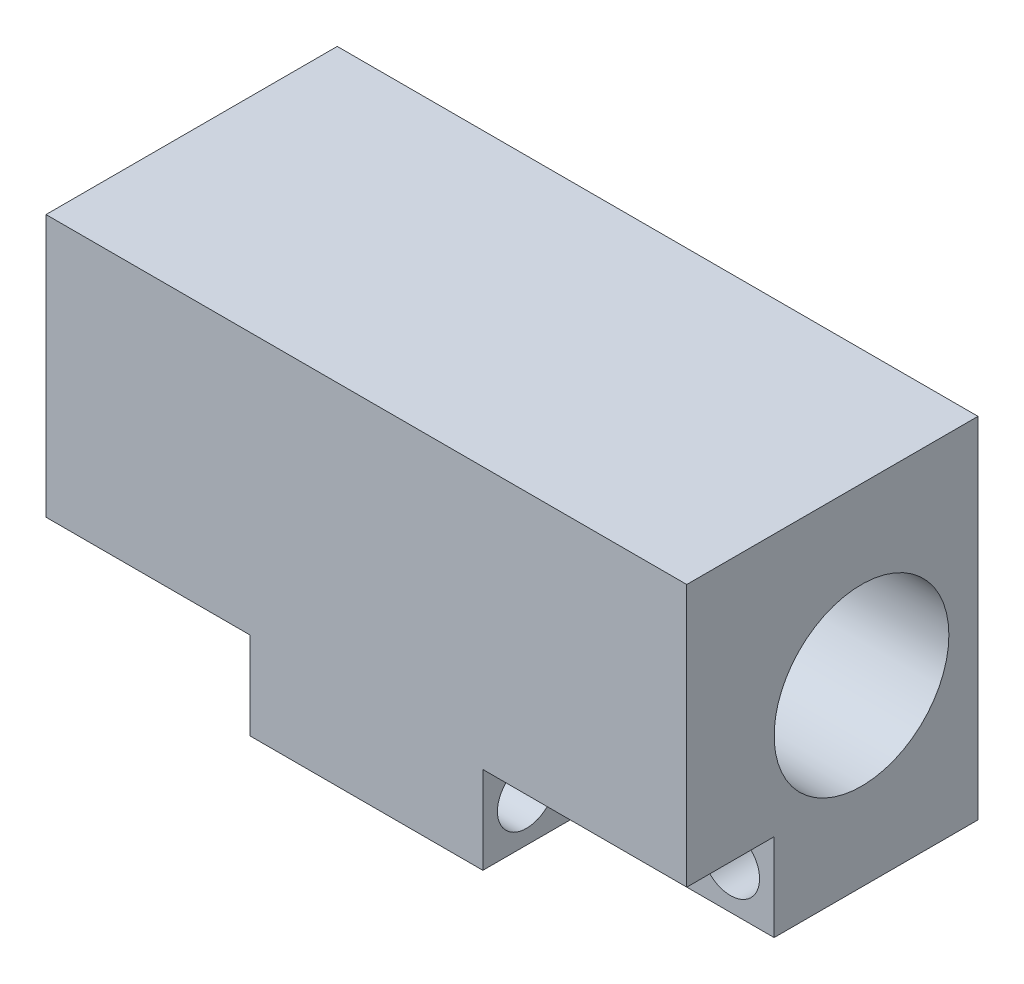
ISO-10303-21;
HEADER;
FILE_DESCRIPTION(('STEP AP214'),'2;1');
FILE_NAME('part.step','',(''),(''),'','','');
FILE_SCHEMA(('AUTOMOTIVE_DESIGN { 1 0 10303 214 1 1 1 1 }'));
ENDSEC;
DATA;
#1=APPLICATION_CONTEXT('core data for automotive mechanical design processes');
#2=APPLICATION_PROTOCOL_DEFINITION('international standard','automotive_design',2000,#1);
#3=PRODUCT_CONTEXT('',#1,'mechanical');
#4=PRODUCT('Part','Part','',(#3));
#5=PRODUCT_RELATED_PRODUCT_CATEGORY('part','',(#4));
#6=PRODUCT_DEFINITION_FORMATION('','',#4);
#7=PRODUCT_DEFINITION_CONTEXT('part definition',#1,'design');
#8=PRODUCT_DEFINITION('design','',#6,#7);
#9=PRODUCT_DEFINITION_SHAPE('','',#8);
#10=(LENGTH_UNIT() NAMED_UNIT(*) SI_UNIT(.MILLI.,.METRE.));
#11=(NAMED_UNIT(*) PLANE_ANGLE_UNIT() SI_UNIT($,.RADIAN.));
#12=(NAMED_UNIT(*) SI_UNIT($,.STERADIAN.) SOLID_ANGLE_UNIT());
#13=UNCERTAINTY_MEASURE_WITH_UNIT(LENGTH_MEASURE(1.E-05),#10,'distance_accuracy_value','');
#14=(GEOMETRIC_REPRESENTATION_CONTEXT(3) GLOBAL_UNCERTAINTY_ASSIGNED_CONTEXT((#13)) GLOBAL_UNIT_ASSIGNED_CONTEXT((#10,
#11,#12)) REPRESENTATION_CONTEXT('',''));
#15=CARTESIAN_POINT('',(0.,0.,0.));
#16=DIRECTION('',(0.,0.,1.));
#17=DIRECTION('',(1.,0.,0.));
#18=AXIS2_PLACEMENT_3D('',#15,#16,#17);
#19=CARTESIAN_POINT('',(11.,6.,-6.));
#20=DIRECTION('',(-1.,0.,0.));
#21=DIRECTION('',(0.,0.,1.));
#22=AXIS2_PLACEMENT_3D('',#19,#20,#21);
#23=CYLINDRICAL_SURFACE('',#22,1.5);
#24=CARTESIAN_POINT('',(-3.,6.,-6.));
#25=DIRECTION('',(1.,0.,0.));
#26=DIRECTION('',(0.,0.,-1.));
#27=AXIS2_PLACEMENT_3D('',#24,#25,#26);
#28=CIRCLE('',#27,1.5);
#29=CARTESIAN_POINT('',(-3.,6.,-7.5));
#30=VERTEX_POINT('',#29);
#31=EDGE_CURVE('E291',#30,#30,#28,.T.);
#32=ORIENTED_EDGE('',*,*,#31,.T.);
#33=EDGE_LOOP('',(#32));
#34=FACE_BOUND('',#33,.T.);
#35=CARTESIAN_POINT('',(-4.5,6.,-6.));
#36=DIRECTION('',(-1.,0.,0.));
#37=DIRECTION('',(0.,0.,1.));
#38=AXIS2_PLACEMENT_3D('',#35,#36,#37);
#39=CIRCLE('',#38,1.5);
#40=CARTESIAN_POINT('',(-4.5,6.,-4.5));
#41=VERTEX_POINT('',#40);
#42=EDGE_CURVE('E37',#41,#41,#39,.F.);
#43=ORIENTED_EDGE('',*,*,#42,.F.);
#44=EDGE_LOOP('',(#43));
#45=FACE_BOUND('',#44,.T.);
#46=ADVANCED_FACE('F33',(#34,#45),#23,.F.);
#47=CARTESIAN_POINT('',(3.,6.,-6.));
#48=DIRECTION('',(1.,0.,0.));
#49=DIRECTION('',(0.,0.,-1.));
#50=AXIS2_PLACEMENT_3D('',#47,#48,#49);
#51=CIRCLE('',#50,1.5);
#52=CARTESIAN_POINT('',(3.,6.,-7.5));
#53=VERTEX_POINT('',#52);
#54=EDGE_CURVE('E287',#53,#53,#51,.T.);
#55=ORIENTED_EDGE('',*,*,#54,.F.);
#56=EDGE_LOOP('',(#55));
#57=FACE_BOUND('',#56,.T.);
#58=CARTESIAN_POINT('',(4.5,6.,-6.));
#59=DIRECTION('',(1.,0.,0.));
#60=DIRECTION('',(0.,0.,-1.));
#61=AXIS2_PLACEMENT_3D('',#58,#59,#60);
#62=CIRCLE('',#61,1.5);
#63=CARTESIAN_POINT('',(4.5,6.,-7.5));
#64=VERTEX_POINT('',#63);
#65=EDGE_CURVE('E231',#64,#64,#62,.F.);
#66=ORIENTED_EDGE('',*,*,#65,.F.);
#67=EDGE_LOOP('',(#66));
#68=FACE_BOUND('',#67,.T.);
#69=ADVANCED_FACE('F364',(#57,#68),#23,.F.);
#70=CARTESIAN_POINT('',(11.,1.5,-1.5));
#71=DIRECTION('',(-1.,0.,0.));
#72=DIRECTION('',(0.,0.,1.));
#73=AXIS2_PLACEMENT_3D('',#70,#71,#72);
#74=CYLINDRICAL_SURFACE('',#73,1.);
#75=CARTESIAN_POINT('',(4.,1.5,-1.5));
#76=DIRECTION('',(-1.,0.,0.));
#77=DIRECTION('',(0.,0.,1.));
#78=AXIS2_PLACEMENT_3D('',#75,#76,#77);
#79=CIRCLE('',#78,1.);
#80=CARTESIAN_POINT('',(4.,1.5,-0.499999999999997));
#81=VERTEX_POINT('',#80);
#82=EDGE_CURVE('E256',#81,#81,#79,.F.);
#83=ORIENTED_EDGE('',*,*,#82,.T.);
#84=EDGE_LOOP('',(#83));
#85=FACE_BOUND('',#84,.T.);
#86=CARTESIAN_POINT('',(-4.,1.5,-1.5));
#87=DIRECTION('',(-1.,0.,0.));
#88=DIRECTION('',(0.,0.,1.));
#89=AXIS2_PLACEMENT_3D('',#86,#87,#88);
#90=CIRCLE('',#89,1.);
#91=CARTESIAN_POINT('',(-4.,1.5,-0.499999999999997));
#92=VERTEX_POINT('',#91);
#93=EDGE_CURVE('E262',#92,#92,#90,.T.);
#94=ORIENTED_EDGE('',*,*,#93,.T.);
#95=EDGE_LOOP('',(#94));
#96=FACE_BOUND('',#95,.T.);
#97=ADVANCED_FACE('F366',(#85,#96),#74,.F.);
#98=CARTESIAN_POINT('',(-11.,12.,0.));
#99=DIRECTION('',(-1.,0.,0.));
#100=DIRECTION('',(0.,0.,1.));
#101=AXIS2_PLACEMENT_3D('',#98,#99,#100);
#102=PLANE('',#101);
#103=DIRECTION('',(0.,-0.5,-0.866025403784439));
#104=VECTOR('',#103,1.);
#105=CARTESIAN_POINT('',(-11.,9.46410161513775,-6.));
#106=LINE('',#105,#104);
#107=CARTESIAN_POINT('',(-11.,9.46410161513775,-6.));
#108=VERTEX_POINT('',#107);
#109=CARTESIAN_POINT('',(-11.,7.73205080756887,-8.99999999999999));
#110=VERTEX_POINT('',#109);
#111=EDGE_CURVE('E50',#108,#110,#106,.T.);
#112=ORIENTED_EDGE('',*,*,#111,.F.);
#113=DIRECTION('',(0.,0.5,-0.866025403784439));
#114=VECTOR('',#113,1.);
#115=CARTESIAN_POINT('',(-11.,7.73205080756887,-2.99999999999999));
#116=LINE('',#115,#114);
#117=CARTESIAN_POINT('',(-11.,7.73205080756887,-2.99999999999999));
#118=VERTEX_POINT('',#117);
#119=EDGE_CURVE('E195',#118,#108,#116,.T.);
#120=ORIENTED_EDGE('',*,*,#119,.F.);
#121=DIRECTION('',(0.,1.,0.));
#122=VECTOR('',#121,1.);
#123=CARTESIAN_POINT('',(-11.,4.26794919243112,-2.99999999999999));
#124=LINE('',#123,#122);
#125=CARTESIAN_POINT('',(-11.,4.26794919243112,-2.99999999999999));
#126=VERTEX_POINT('',#125);
#127=EDGE_CURVE('E198',#126,#118,#124,.T.);
#128=ORIENTED_EDGE('',*,*,#127,.F.);
#129=DIRECTION('',(0.,0.5,0.866025403784439));
#130=VECTOR('',#129,1.);
#131=CARTESIAN_POINT('',(-11.,2.53589838486224,-5.99999999999999));
#132=LINE('',#131,#130);
#133=CARTESIAN_POINT('',(-11.,2.53589838486224,-5.99999999999999));
#134=VERTEX_POINT('',#133);
#135=EDGE_CURVE('E214',#134,#126,#132,.T.);
#136=ORIENTED_EDGE('',*,*,#135,.F.);
#137=DIRECTION('',(0.,-0.5,0.866025403784439));
#138=VECTOR('',#137,1.);
#139=CARTESIAN_POINT('',(-11.,4.26794919243112,-8.99999999999999));
#140=LINE('',#139,#138);
#141=CARTESIAN_POINT('',(-11.,4.26794919243112,-8.99999999999999));
#142=VERTEX_POINT('',#141);
#143=EDGE_CURVE('E211',#142,#134,#140,.T.);
#144=ORIENTED_EDGE('',*,*,#143,.F.);
#145=DIRECTION('',(0.,-1.,0.));
#146=VECTOR('',#145,1.);
#147=CARTESIAN_POINT('',(-11.,7.73205080756887,-8.99999999999999));
#148=LINE('',#147,#146);
#149=EDGE_CURVE('E209',#110,#142,#148,.T.);
#150=ORIENTED_EDGE('',*,*,#149,.F.);
#151=EDGE_LOOP('',(#112,#120,#128,#136,#144,#150));
#152=FACE_BOUND('',#151,.T.);
#153=DIRECTION('',(0.,0.,-1.));
#154=VECTOR('',#153,1.);
#155=CARTESIAN_POINT('',(-11.,0.,0.));
#156=LINE('',#155,#154);
#157=CARTESIAN_POINT('',(-11.,0.,-3.));
#158=VERTEX_POINT('',#157);
#159=CARTESIAN_POINT('',(-11.,0.,-10.));
#160=VERTEX_POINT('',#159);
#161=EDGE_CURVE('E328',#158,#160,#156,.T.);
#162=ORIENTED_EDGE('',*,*,#161,.F.);
#163=DIRECTION('',(0.,-1.,0.));
#164=VECTOR('',#163,1.);
#165=CARTESIAN_POINT('',(-11.,3.,-3.));
#166=LINE('',#165,#164);
#167=CARTESIAN_POINT('',(-11.,3.,-3.));
#168=VERTEX_POINT('',#167);
#169=EDGE_CURVE('E274',#168,#158,#166,.T.);
#170=ORIENTED_EDGE('',*,*,#169,.F.);
#171=DIRECTION('',(0.,0.,1.));
#172=VECTOR('',#171,1.);
#173=CARTESIAN_POINT('',(-11.,3.,0.));
#174=LINE('',#173,#172);
#175=CARTESIAN_POINT('',(-11.,3.,0.));
#176=VERTEX_POINT('',#175);
#177=EDGE_CURVE('E263',#168,#176,#174,.T.);
#178=ORIENTED_EDGE('',*,*,#177,.T.);
#179=DIRECTION('',(0.,-1.,0.));
#180=VECTOR('',#179,1.);
#181=CARTESIAN_POINT('',(-11.,12.,0.));
#182=LINE('',#181,#180);
#183=CARTESIAN_POINT('',(-11.,12.,0.));
#184=VERTEX_POINT('',#183);
#185=EDGE_CURVE('E42',#184,#176,#182,.T.);
#186=ORIENTED_EDGE('',*,*,#185,.F.);
#187=DIRECTION('',(0.,0.,-1.));
#188=VECTOR('',#187,1.);
#189=CARTESIAN_POINT('',(-11.,12.,0.));
#190=LINE('',#189,#188);
#191=CARTESIAN_POINT('',(-11.,12.,-10.));
#192=VERTEX_POINT('',#191);
#193=EDGE_CURVE('E334',#184,#192,#190,.T.);
#194=ORIENTED_EDGE('',*,*,#193,.T.);
#195=DIRECTION('',(0.,-1.,0.));
#196=VECTOR('',#195,1.);
#197=CARTESIAN_POINT('',(-11.,12.,-10.));
#198=LINE('',#197,#196);
#199=EDGE_CURVE('E11',#192,#160,#198,.T.);
#200=ORIENTED_EDGE('',*,*,#199,.T.);
#201=EDGE_LOOP('',(#162,#170,#178,#186,#194,#200));
#202=FACE_BOUND('',#201,.T.);
#203=ADVANCED_FACE('F373',(#152,#202),#102,.T.);
#204=CARTESIAN_POINT('',(11.,12.,0.));
#205=DIRECTION('',(0.,0.,1.));
#206=DIRECTION('',(1.,0.,0.));
#207=AXIS2_PLACEMENT_3D('',#204,#205,#206);
#208=PLANE('',#207);
#209=DIRECTION('',(0.,-1.,0.));
#210=VECTOR('',#209,1.);
#211=CARTESIAN_POINT('',(4.,3.,0.));
#212=LINE('',#211,#210);
#213=CARTESIAN_POINT('',(4.,3.,0.));
#214=VERTEX_POINT('',#213);
#215=CARTESIAN_POINT('',(4.,0.,0.));
#216=VERTEX_POINT('',#215);
#217=EDGE_CURVE('E244',#214,#216,#212,.T.);
#218=ORIENTED_EDGE('',*,*,#217,.F.);
#219=DIRECTION('',(-1.,0.,0.));
#220=VECTOR('',#219,1.);
#221=CARTESIAN_POINT('',(11.,3.,0.));
#222=LINE('',#221,#220);
#223=CARTESIAN_POINT('',(11.,3.,0.));
#224=VERTEX_POINT('',#223);
#225=EDGE_CURVE('E241',#224,#214,#222,.T.);
#226=ORIENTED_EDGE('',*,*,#225,.F.);
#227=DIRECTION('',(0.,-1.,0.));
#228=VECTOR('',#227,1.);
#229=CARTESIAN_POINT('',(11.,12.,0.));
#230=LINE('',#229,#228);
#231=CARTESIAN_POINT('',(11.,12.,0.));
#232=VERTEX_POINT('',#231);
#233=EDGE_CURVE('E348',#232,#224,#230,.T.);
#234=ORIENTED_EDGE('',*,*,#233,.F.);
#235=DIRECTION('',(-1.,0.,0.));
#236=VECTOR('',#235,1.);
#237=CARTESIAN_POINT('',(11.,12.,0.));
#238=LINE('',#237,#236);
#239=EDGE_CURVE('E331',#232,#184,#238,.T.);
#240=ORIENTED_EDGE('',*,*,#239,.T.);
#241=ORIENTED_EDGE('',*,*,#185,.T.);
#242=DIRECTION('',(1.,0.,0.));
#243=VECTOR('',#242,1.);
#244=CARTESIAN_POINT('',(-11.,3.,0.));
#245=LINE('',#244,#243);
#246=CARTESIAN_POINT('',(-4.,3.,0.));
#247=VERTEX_POINT('',#246);
#248=EDGE_CURVE('E266',#176,#247,#245,.T.);
#249=ORIENTED_EDGE('',*,*,#248,.T.);
#250=DIRECTION('',(0.,-1.,0.));
#251=VECTOR('',#250,1.);
#252=CARTESIAN_POINT('',(-4.,3.,0.));
#253=LINE('',#252,#251);
#254=CARTESIAN_POINT('',(-4.,0.,0.));
#255=VERTEX_POINT('',#254);
#256=EDGE_CURVE('E283',#247,#255,#253,.T.);
#257=ORIENTED_EDGE('',*,*,#256,.T.);
#258=DIRECTION('',(-1.,0.,0.));
#259=VECTOR('',#258,1.);
#260=CARTESIAN_POINT('',(11.,0.,0.));
#261=LINE('',#260,#259);
#262=EDGE_CURVE('E343',#216,#255,#261,.T.);
#263=ORIENTED_EDGE('',*,*,#262,.F.);
#264=EDGE_LOOP('',(#218,#226,#234,#240,#241,#249,#257,#263));
#265=FACE_BOUND('',#264,.T.);
#266=ADVANCED_FACE('F415',(#265),#208,.T.);
#267=CARTESIAN_POINT('',(0.,0.,0.));
#268=DIRECTION('',(0.,-1.,0.));
#269=DIRECTION('',(0.,0.,-1.));
#270=AXIS2_PLACEMENT_3D('',#267,#268,#269);
#271=PLANE('',#270);
#272=DIRECTION('',(1.,0.,0.));
#273=VECTOR('',#272,1.);
#274=CARTESIAN_POINT('',(11.,0.,-3.));
#275=LINE('',#274,#273);
#276=CARTESIAN_POINT('',(4.,0.,-3.));
#277=VERTEX_POINT('',#276);
#278=CARTESIAN_POINT('',(11.,0.,-3.));
#279=VERTEX_POINT('',#278);
#280=EDGE_CURVE('E245',#277,#279,#275,.T.);
#281=ORIENTED_EDGE('',*,*,#280,.F.);
#282=DIRECTION('',(0.,0.,-1.));
#283=VECTOR('',#282,1.);
#284=CARTESIAN_POINT('',(4.,0.,0.));
#285=LINE('',#284,#283);
#286=EDGE_CURVE('E237',#216,#277,#285,.T.);
#287=ORIENTED_EDGE('',*,*,#286,.F.);
#288=ORIENTED_EDGE('',*,*,#262,.T.);
#289=DIRECTION('',(0.,0.,-1.));
#290=VECTOR('',#289,1.);
#291=CARTESIAN_POINT('',(-4.,0.,0.));
#292=LINE('',#291,#290);
#293=CARTESIAN_POINT('',(-4.,0.,-3.));
#294=VERTEX_POINT('',#293);
#295=EDGE_CURVE('E275',#255,#294,#292,.T.);
#296=ORIENTED_EDGE('',*,*,#295,.T.);
#297=DIRECTION('',(-1.,0.,0.));
#298=VECTOR('',#297,1.);
#299=CARTESIAN_POINT('',(-11.,0.,-3.));
#300=LINE('',#299,#298);
#301=EDGE_CURVE('E267',#294,#158,#300,.T.);
#302=ORIENTED_EDGE('',*,*,#301,.T.);
#303=ORIENTED_EDGE('',*,*,#161,.T.);
#304=DIRECTION('',(1.,0.,0.));
#305=VECTOR('',#304,1.);
#306=CARTESIAN_POINT('',(0.,0.,-10.));
#307=LINE('',#306,#305);
#308=CARTESIAN_POINT('',(11.,0.,-10.));
#309=VERTEX_POINT('',#308);
#310=EDGE_CURVE('E324',#160,#309,#307,.T.);
#311=ORIENTED_EDGE('',*,*,#310,.T.);
#312=DIRECTION('',(0.,0.,1.));
#313=VECTOR('',#312,1.);
#314=CARTESIAN_POINT('',(11.,0.,-10.));
#315=LINE('',#314,#313);
#316=EDGE_CURVE('E340',#309,#279,#315,.T.);
#317=ORIENTED_EDGE('',*,*,#316,.T.);
#318=EDGE_LOOP('',(#281,#287,#288,#296,#302,#303,#311,#317));
#319=FACE_BOUND('',#318,.T.);
#320=ADVANCED_FACE('F408',(#319),#271,.T.);
#321=CARTESIAN_POINT('',(-9.5,1.5,0.));
#322=DIRECTION('',(0.,0.,-1.));
#323=DIRECTION('',(-1.,0.,0.));
#324=AXIS2_PLACEMENT_3D('',#321,#322,#323);
#325=CYLINDRICAL_SURFACE('',#324,1.);
#326=CARTESIAN_POINT('',(-9.5,1.5,-10.));
#327=DIRECTION('',(0.,0.,-1.));
#328=DIRECTION('',(-1.,0.,0.));
#329=AXIS2_PLACEMENT_3D('',#326,#327,#328);
#330=CIRCLE('',#329,1.);
#331=CARTESIAN_POINT('',(-10.5,1.5,-10.));
#332=VERTEX_POINT('',#331);
#333=EDGE_CURVE('E321',#332,#332,#330,.T.);
#334=ORIENTED_EDGE('',*,*,#333,.T.);
#335=EDGE_LOOP('',(#334));
#336=FACE_BOUND('',#335,.T.);
#337=CARTESIAN_POINT('',(-9.5,1.5,-3.));
#338=DIRECTION('',(0.,0.,1.));
#339=DIRECTION('',(1.,0.,0.));
#340=AXIS2_PLACEMENT_3D('',#337,#338,#339);
#341=CIRCLE('',#340,1.);
#342=CARTESIAN_POINT('',(-8.5,1.5,-3.));
#343=VERTEX_POINT('',#342);
#344=EDGE_CURVE('E286',#343,#343,#341,.F.);
#345=ORIENTED_EDGE('',*,*,#344,.F.);
#346=EDGE_LOOP('',(#345));
#347=FACE_BOUND('',#346,.T.);
#348=ADVANCED_FACE('F404',(#336,#347),#325,.F.);
#349=CARTESIAN_POINT('',(11.,12.,-10.));
#350=DIRECTION('',(1.,0.,0.));
#351=DIRECTION('',(0.,0.,-1.));
#352=AXIS2_PLACEMENT_3D('',#349,#350,#351);
#353=PLANE('',#352);
#354=CARTESIAN_POINT('',(11.,6.,-6.));
#355=DIRECTION('',(1.,0.,0.));
#356=DIRECTION('',(0.,0.,-1.));
#357=AXIS2_PLACEMENT_3D('',#354,#355,#356);
#358=CIRCLE('',#357,3.);
#359=CARTESIAN_POINT('',(11.,6.,-9.));
#360=VERTEX_POINT('',#359);
#361=EDGE_CURVE('E232',#360,#360,#358,.T.);
#362=ORIENTED_EDGE('',*,*,#361,.F.);
#363=EDGE_LOOP('',(#362));
#364=FACE_BOUND('',#363,.T.);
#365=DIRECTION('',(0.,-1.,0.));
#366=VECTOR('',#365,1.);
#367=CARTESIAN_POINT('',(11.,3.,-3.));
#368=LINE('',#367,#366);
#369=CARTESIAN_POINT('',(11.,3.,-3.));
#370=VERTEX_POINT('',#369);
#371=EDGE_CURVE('E252',#370,#279,#368,.T.);
#372=ORIENTED_EDGE('',*,*,#371,.T.);
#373=ORIENTED_EDGE('',*,*,#316,.F.);
#374=DIRECTION('',(0.,-1.,0.));
#375=VECTOR('',#374,1.);
#376=CARTESIAN_POINT('',(11.,12.,-10.));
#377=LINE('',#376,#375);
#378=CARTESIAN_POINT('',(11.,12.,-10.));
#379=VERTEX_POINT('',#378);
#380=EDGE_CURVE('E337',#379,#309,#377,.T.);
#381=ORIENTED_EDGE('',*,*,#380,.F.);
#382=DIRECTION('',(0.,0.,1.));
#383=VECTOR('',#382,1.);
#384=CARTESIAN_POINT('',(11.,12.,-10.));
#385=LINE('',#384,#383);
#386=EDGE_CURVE('E327',#379,#232,#385,.T.);
#387=ORIENTED_EDGE('',*,*,#386,.T.);
#388=ORIENTED_EDGE('',*,*,#233,.T.);
#389=DIRECTION('',(0.,0.,1.));
#390=VECTOR('',#389,1.);
#391=CARTESIAN_POINT('',(11.,3.,0.));
#392=LINE('',#391,#390);
#393=EDGE_CURVE('E235',#370,#224,#392,.T.);
#394=ORIENTED_EDGE('',*,*,#393,.F.);
#395=EDGE_LOOP('',(#372,#373,#381,#387,#388,#394));
#396=FACE_BOUND('',#395,.T.);
#397=ADVANCED_FACE('F407',(#364,#396),#353,.T.);
#398=CARTESIAN_POINT('',(0.,12.,-10.));
#399=DIRECTION('',(0.,0.,-1.));
#400=DIRECTION('',(-1.,0.,0.));
#401=AXIS2_PLACEMENT_3D('',#398,#399,#400);
#402=PLANE('',#401);
#403=CARTESIAN_POINT('',(9.5,1.5,-10.));
#404=DIRECTION('',(0.,0.,1.));
#405=DIRECTION('',(1.,0.,0.));
#406=AXIS2_PLACEMENT_3D('',#403,#404,#405);
#407=CIRCLE('',#406,1.);
#408=CARTESIAN_POINT('',(10.5,1.5,-10.));
#409=VERTEX_POINT('',#408);
#410=EDGE_CURVE('E259',#409,#409,#407,.T.);
#411=ORIENTED_EDGE('',*,*,#410,.T.);
#412=EDGE_LOOP('',(#411));
#413=FACE_BOUND('',#412,.T.);
#414=DIRECTION('',(0.,1.,0.));
#415=VECTOR('',#414,1.);
#416=CARTESIAN_POINT('',(3.,9.2,-10.));
#417=LINE('',#416,#415);
#418=CARTESIAN_POINT('',(3.,2.8,-10.));
#419=VERTEX_POINT('',#418);
#420=CARTESIAN_POINT('',(3.,9.2,-10.));
#421=VERTEX_POINT('',#420);
#422=EDGE_CURVE('E306',#419,#421,#417,.T.);
#423=ORIENTED_EDGE('',*,*,#422,.T.);
#424=DIRECTION('',(-1.,0.,0.));
#425=VECTOR('',#424,1.);
#426=CARTESIAN_POINT('',(3.,9.2,-10.));
#427=LINE('',#426,#425);
#428=CARTESIAN_POINT('',(-3.,9.2,-10.));
#429=VERTEX_POINT('',#428);
#430=EDGE_CURVE('E313',#421,#429,#427,.T.);
#431=ORIENTED_EDGE('',*,*,#430,.T.);
#432=DIRECTION('',(0.,1.,0.));
#433=VECTOR('',#432,1.);
#434=CARTESIAN_POINT('',(-3.,9.2,-10.));
#435=LINE('',#434,#433);
#436=CARTESIAN_POINT('',(-3.,2.8,-10.));
#437=VERTEX_POINT('',#436);
#438=EDGE_CURVE('E296',#437,#429,#435,.T.);
#439=ORIENTED_EDGE('',*,*,#438,.F.);
#440=DIRECTION('',(-1.,0.,0.));
#441=VECTOR('',#440,1.);
#442=CARTESIAN_POINT('',(3.,2.8,-10.));
#443=LINE('',#442,#441);
#444=EDGE_CURVE('E316',#419,#437,#443,.T.);
#445=ORIENTED_EDGE('',*,*,#444,.F.);
#446=EDGE_LOOP('',(#423,#431,#439,#445));
#447=FACE_BOUND('',#446,.T.);
#448=ORIENTED_EDGE('',*,*,#333,.F.);
#449=EDGE_LOOP('',(#448));
#450=FACE_BOUND('',#449,.T.);
#451=ORIENTED_EDGE('',*,*,#310,.F.);
#452=ORIENTED_EDGE('',*,*,#199,.F.);
#453=DIRECTION('',(1.,0.,0.));
#454=VECTOR('',#453,1.);
#455=CARTESIAN_POINT('',(-11.,12.,-10.));
#456=LINE('',#455,#454);
#457=EDGE_CURVE('E325',#192,#379,#456,.T.);
#458=ORIENTED_EDGE('',*,*,#457,.T.);
#459=ORIENTED_EDGE('',*,*,#380,.T.);
#460=EDGE_LOOP('',(#451,#452,#458,#459));
#461=FACE_BOUND('',#460,.T.);
#462=ADVANCED_FACE('F35',(#413,#447,#450,#461),#402,.T.);
#463=CARTESIAN_POINT('',(0.,12.,0.));
#464=DIRECTION('',(0.,-1.,0.));
#465=DIRECTION('',(0.,0.,-1.));
#466=AXIS2_PLACEMENT_3D('',#463,#464,#465);
#467=PLANE('',#466);
#468=ORIENTED_EDGE('',*,*,#457,.F.);
#469=ORIENTED_EDGE('',*,*,#193,.F.);
#470=ORIENTED_EDGE('',*,*,#239,.F.);
#471=ORIENTED_EDGE('',*,*,#386,.F.);
#472=EDGE_LOOP('',(#468,#469,#470,#471));
#473=FACE_BOUND('',#472,.T.);
#474=ADVANCED_FACE('F402',(#473),#467,.F.);
#475=CARTESIAN_POINT('',(3.,6.,-6.));
#476=DIRECTION('',(-1.,0.,0.));
#477=DIRECTION('',(0.,0.,1.));
#478=AXIS2_PLACEMENT_3D('',#475,#476,#477);
#479=CYLINDRICAL_SURFACE('',#478,3.2);
#480=DIRECTION('',(-1.,0.,0.));
#481=VECTOR('',#480,1.);
#482=CARTESIAN_POINT('',(3.,9.2,-6.));
#483=LINE('',#482,#481);
#484=CARTESIAN_POINT('',(3.,9.2,-6.));
#485=VERTEX_POINT('',#484);
#486=CARTESIAN_POINT('',(-3.,9.2,-6.));
#487=VERTEX_POINT('',#486);
#488=EDGE_CURVE('E311',#485,#487,#483,.T.);
#489=ORIENTED_EDGE('',*,*,#488,.F.);
#490=CARTESIAN_POINT('',(3.,6.,-6.));
#491=DIRECTION('',(1.,0.,0.));
#492=DIRECTION('',(0.,0.,-1.));
#493=AXIS2_PLACEMENT_3D('',#490,#491,#492);
#494=CIRCLE('',#493,3.2);
#495=CARTESIAN_POINT('',(3.,2.8,-6.));
#496=VERTEX_POINT('',#495);
#497=EDGE_CURVE('E301',#485,#496,#494,.T.);
#498=ORIENTED_EDGE('',*,*,#497,.T.);
#499=DIRECTION('',(-1.,0.,0.));
#500=VECTOR('',#499,1.);
#501=CARTESIAN_POINT('',(3.,2.8,-6.));
#502=LINE('',#501,#500);
#503=CARTESIAN_POINT('',(-3.,2.8,-6.));
#504=VERTEX_POINT('',#503);
#505=EDGE_CURVE('E319',#496,#504,#502,.T.);
#506=ORIENTED_EDGE('',*,*,#505,.T.);
#507=CARTESIAN_POINT('',(-3.,6.,-6.));
#508=DIRECTION('',(1.,0.,0.));
#509=DIRECTION('',(0.,0.,-1.));
#510=AXIS2_PLACEMENT_3D('',#507,#508,#509);
#511=CIRCLE('',#510,3.2);
#512=EDGE_CURVE('E290',#487,#504,#511,.T.);
#513=ORIENTED_EDGE('',*,*,#512,.F.);
#514=EDGE_LOOP('',(#489,#498,#506,#513));
#515=FACE_BOUND('',#514,.T.);
#516=ADVANCED_FACE('F398',(#515),#479,.F.);
#517=CARTESIAN_POINT('',(3.,2.8,-10.));
#518=DIRECTION('',(0.,1.,0.));
#519=DIRECTION('',(0.,0.,1.));
#520=AXIS2_PLACEMENT_3D('',#517,#518,#519);
#521=PLANE('',#520);
#522=ORIENTED_EDGE('',*,*,#505,.F.);
#523=DIRECTION('',(0.,0.,-1.));
#524=VECTOR('',#523,1.);
#525=CARTESIAN_POINT('',(3.,2.8,-10.));
#526=LINE('',#525,#524);
#527=EDGE_CURVE('E304',#496,#419,#526,.T.);
#528=ORIENTED_EDGE('',*,*,#527,.T.);
#529=ORIENTED_EDGE('',*,*,#444,.T.);
#530=DIRECTION('',(0.,0.,-1.));
#531=VECTOR('',#530,1.);
#532=CARTESIAN_POINT('',(-3.,2.8,-10.));
#533=LINE('',#532,#531);
#534=EDGE_CURVE('E294',#504,#437,#533,.T.);
#535=ORIENTED_EDGE('',*,*,#534,.F.);
#536=EDGE_LOOP('',(#522,#528,#529,#535));
#537=FACE_BOUND('',#536,.T.);
#538=ADVANCED_FACE('F394',(#537),#521,.T.);
#539=CARTESIAN_POINT('',(3.,9.2,-6.));
#540=DIRECTION('',(0.,-1.,0.));
#541=DIRECTION('',(0.,0.,-1.));
#542=AXIS2_PLACEMENT_3D('',#539,#540,#541);
#543=PLANE('',#542);
#544=ORIENTED_EDGE('',*,*,#430,.F.);
#545=DIRECTION('',(0.,0.,1.));
#546=VECTOR('',#545,1.);
#547=CARTESIAN_POINT('',(3.,9.2,-6.));
#548=LINE('',#547,#546);
#549=EDGE_CURVE('E309',#421,#485,#548,.T.);
#550=ORIENTED_EDGE('',*,*,#549,.T.);
#551=ORIENTED_EDGE('',*,*,#488,.T.);
#552=DIRECTION('',(0.,0.,1.));
#553=VECTOR('',#552,1.);
#554=CARTESIAN_POINT('',(-3.,9.2,-6.));
#555=LINE('',#554,#553);
#556=EDGE_CURVE('E298',#429,#487,#555,.T.);
#557=ORIENTED_EDGE('',*,*,#556,.F.);
#558=EDGE_LOOP('',(#544,#550,#551,#557));
#559=FACE_BOUND('',#558,.T.);
#560=ADVANCED_FACE('F390',(#559),#543,.T.);
#561=CARTESIAN_POINT('',(3.,6.,-6.));
#562=DIRECTION('',(1.,0.,0.));
#563=DIRECTION('',(0.,0.,-1.));
#564=AXIS2_PLACEMENT_3D('',#561,#562,#563);
#565=PLANE('',#564);
#566=ORIENTED_EDGE('',*,*,#54,.T.);
#567=EDGE_LOOP('',(#566));
#568=FACE_BOUND('',#567,.T.);
#569=ORIENTED_EDGE('',*,*,#497,.F.);
#570=ORIENTED_EDGE('',*,*,#549,.F.);
#571=ORIENTED_EDGE('',*,*,#422,.F.);
#572=ORIENTED_EDGE('',*,*,#527,.F.);
#573=EDGE_LOOP('',(#569,#570,#571,#572));
#574=FACE_BOUND('',#573,.T.);
#575=ADVANCED_FACE('F386',(#568,#574),#565,.F.);
#576=CARTESIAN_POINT('',(-3.,6.,-6.));
#577=DIRECTION('',(1.,0.,0.));
#578=DIRECTION('',(0.,0.,-1.));
#579=AXIS2_PLACEMENT_3D('',#576,#577,#578);
#580=PLANE('',#579);
#581=ORIENTED_EDGE('',*,*,#31,.F.);
#582=EDGE_LOOP('',(#581));
#583=FACE_BOUND('',#582,.T.);
#584=ORIENTED_EDGE('',*,*,#512,.T.);
#585=ORIENTED_EDGE('',*,*,#534,.T.);
#586=ORIENTED_EDGE('',*,*,#438,.T.);
#587=ORIENTED_EDGE('',*,*,#556,.T.);
#588=EDGE_LOOP('',(#584,#585,#586,#587));
#589=FACE_BOUND('',#588,.T.);
#590=ADVANCED_FACE('F382',(#583,#589),#580,.T.);
#591=CARTESIAN_POINT('',(-11.,3.,-3.));
#592=DIRECTION('',(0.,0.,1.));
#593=DIRECTION('',(1.,0.,0.));
#594=AXIS2_PLACEMENT_3D('',#591,#592,#593);
#595=PLANE('',#594);
#596=ORIENTED_EDGE('',*,*,#301,.F.);
#597=DIRECTION('',(0.,-1.,0.));
#598=VECTOR('',#597,1.);
#599=CARTESIAN_POINT('',(-4.,3.,-3.));
#600=LINE('',#599,#598);
#601=CARTESIAN_POINT('',(-4.,3.,-3.));
#602=VERTEX_POINT('',#601);
#603=EDGE_CURVE('E281',#602,#294,#600,.T.);
#604=ORIENTED_EDGE('',*,*,#603,.F.);
#605=DIRECTION('',(-1.,0.,0.));
#606=VECTOR('',#605,1.);
#607=CARTESIAN_POINT('',(-11.,3.,-3.));
#608=LINE('',#607,#606);
#609=EDGE_CURVE('E272',#602,#168,#608,.T.);
#610=ORIENTED_EDGE('',*,*,#609,.T.);
#611=ORIENTED_EDGE('',*,*,#169,.T.);
#612=EDGE_LOOP('',(#596,#604,#610,#611));
#613=FACE_BOUND('',#612,.T.);
#614=ORIENTED_EDGE('',*,*,#344,.T.);
#615=EDGE_LOOP('',(#614));
#616=FACE_BOUND('',#615,.T.);
#617=ADVANCED_FACE('F385',(#613,#616),#595,.T.);
#618=CARTESIAN_POINT('',(-4.,3.,0.));
#619=DIRECTION('',(-1.,0.,0.));
#620=DIRECTION('',(0.,0.,1.));
#621=AXIS2_PLACEMENT_3D('',#618,#619,#620);
#622=PLANE('',#621);
#623=ORIENTED_EDGE('',*,*,#93,.F.);
#624=EDGE_LOOP('',(#623));
#625=FACE_BOUND('',#624,.T.);
#626=ORIENTED_EDGE('',*,*,#295,.F.);
#627=ORIENTED_EDGE('',*,*,#256,.F.);
#628=DIRECTION('',(0.,0.,-1.));
#629=VECTOR('',#628,1.);
#630=CARTESIAN_POINT('',(-4.,3.,0.));
#631=LINE('',#630,#629);
#632=EDGE_CURVE('E270',#247,#602,#631,.T.);
#633=ORIENTED_EDGE('',*,*,#632,.T.);
#634=ORIENTED_EDGE('',*,*,#603,.T.);
#635=EDGE_LOOP('',(#626,#627,#633,#634));
#636=FACE_BOUND('',#635,.T.);
#637=ADVANCED_FACE('F380',(#625,#636),#622,.T.);
#638=CARTESIAN_POINT('',(0.,3.,0.));
#639=DIRECTION('',(0.,-1.,0.));
#640=DIRECTION('',(0.,0.,-1.));
#641=AXIS2_PLACEMENT_3D('',#638,#639,#640);
#642=PLANE('',#641);
#643=ORIENTED_EDGE('',*,*,#177,.F.);
#644=ORIENTED_EDGE('',*,*,#609,.F.);
#645=ORIENTED_EDGE('',*,*,#632,.F.);
#646=ORIENTED_EDGE('',*,*,#248,.F.);
#647=EDGE_LOOP('',(#643,#644,#645,#646));
#648=FACE_BOUND('',#647,.T.);
#649=ADVANCED_FACE('F465',(#648),#642,.T.);
#650=CARTESIAN_POINT('',(9.5,1.5,0.));
#651=DIRECTION('',(0.,0.,-1.));
#652=DIRECTION('',(-1.,0.,0.));
#653=AXIS2_PLACEMENT_3D('',#650,#651,#652);
#654=CYLINDRICAL_SURFACE('',#653,1.);
#655=CARTESIAN_POINT('',(9.5,1.5,-3.));
#656=DIRECTION('',(0.,0.,-1.));
#657=DIRECTION('',(-1.,0.,0.));
#658=AXIS2_PLACEMENT_3D('',#655,#656,#657);
#659=CIRCLE('',#658,1.);
#660=CARTESIAN_POINT('',(8.5,1.5,-3.));
#661=VERTEX_POINT('',#660);
#662=EDGE_CURVE('E255',#661,#661,#659,.T.);
#663=ORIENTED_EDGE('',*,*,#662,.F.);
#664=EDGE_LOOP('',(#663));
#665=FACE_BOUND('',#664,.T.);
#666=ORIENTED_EDGE('',*,*,#410,.F.);
#667=EDGE_LOOP('',(#666));
#668=FACE_BOUND('',#667,.T.);
#669=ADVANCED_FACE('F461',(#665,#668),#654,.F.);
#670=CARTESIAN_POINT('',(4.,3.,0.));
#671=DIRECTION('',(-1.,0.,0.));
#672=DIRECTION('',(0.,0.,1.));
#673=AXIS2_PLACEMENT_3D('',#670,#671,#672);
#674=PLANE('',#673);
#675=ORIENTED_EDGE('',*,*,#286,.T.);
#676=DIRECTION('',(0.,-1.,0.));
#677=VECTOR('',#676,1.);
#678=CARTESIAN_POINT('',(4.,3.,-3.));
#679=LINE('',#678,#677);
#680=CARTESIAN_POINT('',(4.,3.,-3.));
#681=VERTEX_POINT('',#680);
#682=EDGE_CURVE('E250',#681,#277,#679,.T.);
#683=ORIENTED_EDGE('',*,*,#682,.F.);
#684=DIRECTION('',(0.,0.,-1.));
#685=VECTOR('',#684,1.);
#686=CARTESIAN_POINT('',(4.,3.,0.));
#687=LINE('',#686,#685);
#688=EDGE_CURVE('E239',#214,#681,#687,.T.);
#689=ORIENTED_EDGE('',*,*,#688,.F.);
#690=ORIENTED_EDGE('',*,*,#217,.T.);
#691=EDGE_LOOP('',(#675,#683,#689,#690));
#692=FACE_BOUND('',#691,.T.);
#693=ORIENTED_EDGE('',*,*,#82,.F.);
#694=EDGE_LOOP('',(#693));
#695=FACE_BOUND('',#694,.T.);
#696=ADVANCED_FACE('F450',(#692,#695),#674,.F.);
#697=CARTESIAN_POINT('',(11.,3.,-3.));
#698=DIRECTION('',(0.,0.,-1.));
#699=DIRECTION('',(-1.,0.,0.));
#700=AXIS2_PLACEMENT_3D('',#697,#698,#699);
#701=PLANE('',#700);
#702=ORIENTED_EDGE('',*,*,#662,.T.);
#703=EDGE_LOOP('',(#702));
#704=FACE_BOUND('',#703,.T.);
#705=ORIENTED_EDGE('',*,*,#280,.T.);
#706=ORIENTED_EDGE('',*,*,#371,.F.);
#707=DIRECTION('',(1.,0.,0.));
#708=VECTOR('',#707,1.);
#709=CARTESIAN_POINT('',(11.,3.,-3.));
#710=LINE('',#709,#708);
#711=EDGE_CURVE('E58',#681,#370,#710,.T.);
#712=ORIENTED_EDGE('',*,*,#711,.F.);
#713=ORIENTED_EDGE('',*,*,#682,.T.);
#714=EDGE_LOOP('',(#705,#706,#712,#713));
#715=FACE_BOUND('',#714,.T.);
#716=ADVANCED_FACE('F452',(#704,#715),#701,.F.);
#717=CARTESIAN_POINT('',(0.,3.,0.));
#718=DIRECTION('',(0.,-1.,0.));
#719=DIRECTION('',(0.,0.,-1.));
#720=AXIS2_PLACEMENT_3D('',#717,#718,#719);
#721=PLANE('',#720);
#722=ORIENTED_EDGE('',*,*,#393,.T.);
#723=ORIENTED_EDGE('',*,*,#225,.T.);
#724=ORIENTED_EDGE('',*,*,#688,.T.);
#725=ORIENTED_EDGE('',*,*,#711,.T.);
#726=EDGE_LOOP('',(#722,#723,#724,#725));
#727=FACE_BOUND('',#726,.T.);
#728=ADVANCED_FACE('F448',(#727),#721,.T.);
#729=CARTESIAN_POINT('',(4.5,6.,-6.));
#730=DIRECTION('',(1.,0.,0.));
#731=DIRECTION('',(0.,0.,-1.));
#732=AXIS2_PLACEMENT_3D('',#729,#730,#731);
#733=PLANE('',#732);
#734=CARTESIAN_POINT('',(4.5,6.,-6.));
#735=DIRECTION('',(1.,0.,0.));
#736=DIRECTION('',(0.,0.,-1.));
#737=AXIS2_PLACEMENT_3D('',#734,#735,#736);
#738=CIRCLE('',#737,3.);
#739=CARTESIAN_POINT('',(4.5,6.,-9.));
#740=VERTEX_POINT('',#739);
#741=EDGE_CURVE('E228',#740,#740,#738,.T.);
#742=ORIENTED_EDGE('',*,*,#741,.T.);
#743=EDGE_LOOP('',(#742));
#744=FACE_BOUND('',#743,.T.);
#745=ORIENTED_EDGE('',*,*,#65,.T.);
#746=EDGE_LOOP('',(#745));
#747=FACE_BOUND('',#746,.T.);
#748=ADVANCED_FACE('F362',(#744,#747),#733,.T.);
#749=CARTESIAN_POINT('',(4.5,6.,-6.));
#750=DIRECTION('',(1.,0.,0.));
#751=DIRECTION('',(0.,0.,-1.));
#752=AXIS2_PLACEMENT_3D('',#749,#750,#751);
#753=CYLINDRICAL_SURFACE('',#752,3.);
#754=CARTESIAN_POINT('',(4.5,6.,-9.));
#755=CARTESIAN_POINT('',(4.56770833333333,6.,-9.));
#756=CARTESIAN_POINT('',(4.63541666666667,6.,-9.));
#757=CARTESIAN_POINT('',(4.77083333333333,6.,-9.));
#758=CARTESIAN_POINT('',(4.83854166666667,6.,-9.));
#759=CARTESIAN_POINT('',(4.97395833333333,6.,-9.));
#760=CARTESIAN_POINT('',(5.04166666666667,6.,-9.));
#761=CARTESIAN_POINT('',(5.17708333333333,6.,-9.));
#762=CARTESIAN_POINT('',(5.24479166666667,6.,-9.));
#763=CARTESIAN_POINT('',(5.38020833333333,6.,-9.));
#764=CARTESIAN_POINT('',(5.44791666666667,6.,-9.));
#765=CARTESIAN_POINT('',(5.58333333333333,6.,-9.));
#766=CARTESIAN_POINT('',(5.65104166666667,6.,-9.));
#767=CARTESIAN_POINT('',(5.78645833333333,6.,-9.));
#768=CARTESIAN_POINT('',(5.85416666666667,6.,-9.));
#769=CARTESIAN_POINT('',(5.98958333333333,6.,-9.));
#770=CARTESIAN_POINT('',(6.05729166666667,6.,-9.));
#771=CARTESIAN_POINT('',(6.19270833333333,6.,-9.));
#772=CARTESIAN_POINT('',(6.26041666666667,6.,-9.));
#773=CARTESIAN_POINT('',(6.39583333333333,6.,-9.));
#774=CARTESIAN_POINT('',(6.46354166666667,6.,-9.));
#775=CARTESIAN_POINT('',(6.59895833333333,6.,-9.));
#776=CARTESIAN_POINT('',(6.66666666666667,6.,-9.));
#777=CARTESIAN_POINT('',(6.80208333333333,6.,-9.));
#778=CARTESIAN_POINT('',(6.86979166666667,6.,-9.));
#779=CARTESIAN_POINT('',(7.00520833333333,6.,-9.));
#780=CARTESIAN_POINT('',(7.07291666666667,6.,-9.));
#781=CARTESIAN_POINT('',(7.20833333333333,6.,-9.));
#782=CARTESIAN_POINT('',(7.27604166666667,6.,-9.));
#783=CARTESIAN_POINT('',(7.41145833333333,6.,-9.));
#784=CARTESIAN_POINT('',(7.47916666666667,6.,-9.));
#785=CARTESIAN_POINT('',(7.61458333333333,6.,-9.));
#786=CARTESIAN_POINT('',(7.68229166666666,6.,-9.));
#787=CARTESIAN_POINT('',(7.81770833333333,6.,-9.));
#788=CARTESIAN_POINT('',(7.88541666666667,6.,-9.));
#789=CARTESIAN_POINT('',(8.02083333333333,6.,-9.));
#790=CARTESIAN_POINT('',(8.08854166666667,6.,-9.));
#791=CARTESIAN_POINT('',(8.22395833333333,6.,-9.));
#792=CARTESIAN_POINT('',(8.29166666666667,6.,-9.));
#793=CARTESIAN_POINT('',(8.42708333333333,6.,-9.));
#794=CARTESIAN_POINT('',(8.49479166666666,6.,-9.));
#795=CARTESIAN_POINT('',(8.63020833333333,6.,-9.));
#796=CARTESIAN_POINT('',(8.69791666666666,6.,-9.));
#797=CARTESIAN_POINT('',(8.83333333333333,6.,-9.));
#798=CARTESIAN_POINT('',(8.90104166666666,6.,-9.));
#799=CARTESIAN_POINT('',(9.03645833333333,6.,-9.));
#800=CARTESIAN_POINT('',(9.10416666666666,6.,-9.));
#801=CARTESIAN_POINT('',(9.23958333333333,6.,-9.));
#802=CARTESIAN_POINT('',(9.30729166666666,6.,-9.));
#803=CARTESIAN_POINT('',(9.44270833333333,6.,-9.));
#804=CARTESIAN_POINT('',(9.51041666666667,6.,-9.));
#805=CARTESIAN_POINT('',(9.64583333333333,6.,-9.));
#806=CARTESIAN_POINT('',(9.71354166666667,6.,-9.));
#807=CARTESIAN_POINT('',(9.84895833333333,6.,-9.));
#808=CARTESIAN_POINT('',(9.91666666666666,6.,-9.));
#809=CARTESIAN_POINT('',(10.0520833333333,6.,-9.));
#810=CARTESIAN_POINT('',(10.1197916666667,6.,-9.));
#811=CARTESIAN_POINT('',(10.2552083333333,6.,-9.));
#812=CARTESIAN_POINT('',(10.3229166666667,6.,-9.));
#813=CARTESIAN_POINT('',(10.4583333333333,6.,-9.));
#814=CARTESIAN_POINT('',(10.5260416666667,6.,-9.));
#815=CARTESIAN_POINT('',(10.6614583333333,6.,-9.));
#816=CARTESIAN_POINT('',(10.7291666666667,6.,-9.));
#817=CARTESIAN_POINT('',(10.8645833333333,6.,-9.));
#818=CARTESIAN_POINT('',(10.9322916666667,6.,-9.));
#819=CARTESIAN_POINT('',(11.,6.,-9.));
#820=B_SPLINE_CURVE_WITH_KNOTS('',3,(#754,#755,#756,#757,#758,#759,#760,#761,#762,#763,#764,
#765,#766,#767,#768,#769,#770,#771,#772,#773,#774,#775,#776,#777,#778,#779,#780,#781,#782,#783,
#784,#785,#786,#787,#788,#789,#790,#791,#792,#793,#794,#795,#796,#797,#798,#799,#800,#801,#802,
#803,#804,#805,#806,#807,#808,#809,#810,#811,#812,#813,#814,#815,#816,#817,#818,#819),
.UNSPECIFIED.,.F.,.F.,(4,2,2,2,2,2,2,2,2,2,2,2,2,2,2,2,2,2,2,2,2,2,2,2,2,2,2,2,2,2,2,2,4),(0.,
0.203125,0.40625,0.609375000000001,0.812500000000001,1.015625,1.21875,1.421875,1.625,1.828125,
2.03125,2.234375,2.4375,2.640625,2.84375,3.046875,3.25,3.453125,3.65625,3.859375,4.0625,
4.265625,4.46875,4.671875,4.875,5.078125,5.28125,5.484375,5.6875,5.890625,6.09375,6.296875,6.5),.UNSPECIFIED.);
#821=EDGE_CURVE('BSEAM532',#740,#360,#820,.T.);
#822=ORIENTED_EDGE('',*,*,#741,.F.);
#823=ORIENTED_EDGE('',*,*,#361,.T.);
#824=ORIENTED_EDGE('',*,*,#821,.T.);
#825=ORIENTED_EDGE('',*,*,#821,.F.);
#826=EDGE_LOOP('',(#822,#824,#823,#825));
#827=FACE_BOUND('',#826,.T.);
#828=ADVANCED_FACE('F532',(#827),#753,.F.);
#829=CARTESIAN_POINT('',(-4.5,0.,0.));
#830=DIRECTION('',(-1.,0.,0.));
#831=DIRECTION('',(0.,0.,1.));
#832=AXIS2_PLACEMENT_3D('',#829,#830,#831);
#833=PLANE('',#832);
#834=DIRECTION('',(0.,-0.5,-0.866025403784439));
#835=VECTOR('',#834,1.);
#836=CARTESIAN_POINT('',(-4.5,9.46410161513775,-6.));
#837=LINE('',#836,#835);
#838=CARTESIAN_POINT('',(-4.5,9.46410161513775,-6.));
#839=VERTEX_POINT('',#838);
#840=CARTESIAN_POINT('',(-4.5,7.73205080756887,-8.99999999999999));
#841=VERTEX_POINT('',#840);
#842=EDGE_CURVE('E175',#839,#841,#837,.T.);
#843=ORIENTED_EDGE('',*,*,#842,.T.);
#844=DIRECTION('',(0.,-1.,0.));
#845=VECTOR('',#844,1.);
#846=CARTESIAN_POINT('',(-4.5,7.73205080756887,-8.99999999999999));
#847=LINE('',#846,#845);
#848=CARTESIAN_POINT('',(-4.5,4.26794919243112,-8.99999999999999));
#849=VERTEX_POINT('',#848);
#850=EDGE_CURVE('E184',#841,#849,#847,.T.);
#851=ORIENTED_EDGE('',*,*,#850,.T.);
#852=DIRECTION('',(0.,-0.5,0.866025403784439));
#853=VECTOR('',#852,1.);
#854=CARTESIAN_POINT('',(-4.5,4.26794919243112,-8.99999999999999));
#855=LINE('',#854,#853);
#856=CARTESIAN_POINT('',(-4.5,2.53589838486224,-5.99999999999999));
#857=VERTEX_POINT('',#856);
#858=EDGE_CURVE('E189',#849,#857,#855,.T.);
#859=ORIENTED_EDGE('',*,*,#858,.T.);
#860=DIRECTION('',(0.,0.5,0.866025403784439));
#861=VECTOR('',#860,1.);
#862=CARTESIAN_POINT('',(-4.5,2.53589838486224,-5.99999999999999));
#863=LINE('',#862,#861);
#864=CARTESIAN_POINT('',(-4.5,4.26794919243112,-2.99999999999999));
#865=VERTEX_POINT('',#864);
#866=EDGE_CURVE('E202',#857,#865,#863,.T.);
#867=ORIENTED_EDGE('',*,*,#866,.T.);
#868=DIRECTION('',(0.,1.,0.));
#869=VECTOR('',#868,1.);
#870=CARTESIAN_POINT('',(-4.5,4.26794919243112,-2.99999999999999));
#871=LINE('',#870,#869);
#872=CARTESIAN_POINT('',(-4.5,7.73205080756887,-2.99999999999999));
#873=VERTEX_POINT('',#872);
#874=EDGE_CURVE('E205',#865,#873,#871,.T.);
#875=ORIENTED_EDGE('',*,*,#874,.T.);
#876=DIRECTION('',(0.,0.5,-0.866025403784439));
#877=VECTOR('',#876,1.);
#878=CARTESIAN_POINT('',(-4.5,7.73205080756887,-2.99999999999999));
#879=LINE('',#878,#877);
#880=EDGE_CURVE('E181',#873,#839,#879,.T.);
#881=ORIENTED_EDGE('',*,*,#880,.T.);
#882=EDGE_LOOP('',(#843,#851,#859,#867,#875,#881));
#883=FACE_BOUND('',#882,.T.);
#884=ORIENTED_EDGE('',*,*,#42,.T.);
#885=EDGE_LOOP('',(#884));
#886=FACE_BOUND('',#885,.T.);
#887=ADVANCED_FACE('F191',(#883,#886),#833,.T.);
#888=CARTESIAN_POINT('',(-4.5,9.46410161513775,-6.));
#889=DIRECTION('',(0.,0.866025403784439,-0.5));
#890=DIRECTION('',(0.,0.5,0.866025403784439));
#891=AXIS2_PLACEMENT_3D('',#888,#889,#890);
#892=PLANE('',#891);
#893=ORIENTED_EDGE('',*,*,#111,.T.);
#894=DIRECTION('',(-1.,0.,0.));
#895=VECTOR('',#894,1.);
#896=CARTESIAN_POINT('',(-4.5,7.73205080756887,-8.99999999999999));
#897=LINE('',#896,#895);
#898=EDGE_CURVE('E171',#841,#110,#897,.T.);
#899=ORIENTED_EDGE('',*,*,#898,.F.);
#900=ORIENTED_EDGE('',*,*,#842,.F.);
#901=DIRECTION('',(-1.,0.,0.));
#902=VECTOR('',#901,1.);
#903=CARTESIAN_POINT('',(-4.5,9.46410161513775,-6.));
#904=LINE('',#903,#902);
#905=EDGE_CURVE('E219',#839,#108,#904,.T.);
#906=ORIENTED_EDGE('',*,*,#905,.T.);
#907=EDGE_LOOP('',(#893,#899,#900,#906));
#908=FACE_BOUND('',#907,.T.);
#909=ADVANCED_FACE('F173',(#908),#892,.F.);
#910=CARTESIAN_POINT('',(-4.5,7.73205080756887,-2.99999999999999));
#911=DIRECTION('',(0.,0.866025403784439,0.5));
#912=DIRECTION('',(0.,-0.5,0.866025403784439));
#913=AXIS2_PLACEMENT_3D('',#910,#911,#912);
#914=PLANE('',#913);
#915=ORIENTED_EDGE('',*,*,#119,.T.);
#916=ORIENTED_EDGE('',*,*,#905,.F.);
#917=ORIENTED_EDGE('',*,*,#880,.F.);
#918=DIRECTION('',(-1.,0.,0.));
#919=VECTOR('',#918,1.);
#920=CARTESIAN_POINT('',(-4.5,7.73205080756887,-2.99999999999999));
#921=LINE('',#920,#919);
#922=EDGE_CURVE('E221',#873,#118,#921,.T.);
#923=ORIENTED_EDGE('',*,*,#922,.T.);
#924=EDGE_LOOP('',(#915,#916,#917,#923));
#925=FACE_BOUND('',#924,.T.);
#926=ADVANCED_FACE('F573',(#925),#914,.F.);
#927=CARTESIAN_POINT('',(-4.5,4.26794919243112,-2.99999999999999));
#928=DIRECTION('',(0.,0.,1.));
#929=DIRECTION('',(1.,0.,0.));
#930=AXIS2_PLACEMENT_3D('',#927,#928,#929);
#931=PLANE('',#930);
#932=ORIENTED_EDGE('',*,*,#127,.T.);
#933=ORIENTED_EDGE('',*,*,#922,.F.);
#934=ORIENTED_EDGE('',*,*,#874,.F.);
#935=DIRECTION('',(-1.,0.,0.));
#936=VECTOR('',#935,1.);
#937=CARTESIAN_POINT('',(-4.5,4.26794919243112,-2.99999999999999));
#938=LINE('',#937,#936);
#939=EDGE_CURVE('E223',#865,#126,#938,.T.);
#940=ORIENTED_EDGE('',*,*,#939,.T.);
#941=EDGE_LOOP('',(#932,#933,#934,#940));
#942=FACE_BOUND('',#941,.T.);
#943=ADVANCED_FACE('F582',(#942),#931,.F.);
#944=CARTESIAN_POINT('',(-4.5,2.53589838486224,-5.99999999999999));
#945=DIRECTION('',(0.,-0.866025403784438,0.5));
#946=DIRECTION('',(0.,-0.5,-0.866025403784438));
#947=AXIS2_PLACEMENT_3D('',#944,#945,#946);
#948=PLANE('',#947);
#949=ORIENTED_EDGE('',*,*,#135,.T.);
#950=ORIENTED_EDGE('',*,*,#939,.F.);
#951=ORIENTED_EDGE('',*,*,#866,.F.);
#952=DIRECTION('',(-1.,0.,0.));
#953=VECTOR('',#952,1.);
#954=CARTESIAN_POINT('',(-4.5,2.53589838486224,-5.99999999999999));
#955=LINE('',#954,#953);
#956=EDGE_CURVE('E225',#857,#134,#955,.T.);
#957=ORIENTED_EDGE('',*,*,#956,.T.);
#958=EDGE_LOOP('',(#949,#950,#951,#957));
#959=FACE_BOUND('',#958,.T.);
#960=ADVANCED_FACE('F592',(#959),#948,.F.);
#961=CARTESIAN_POINT('',(-4.5,4.26794919243112,-8.99999999999999));
#962=DIRECTION('',(0.,-0.866025403784439,-0.5));
#963=DIRECTION('',(0.,0.5,-0.866025403784439));
#964=AXIS2_PLACEMENT_3D('',#961,#962,#963);
#965=PLANE('',#964);
#966=ORIENTED_EDGE('',*,*,#143,.T.);
#967=ORIENTED_EDGE('',*,*,#956,.F.);
#968=ORIENTED_EDGE('',*,*,#858,.F.);
#969=DIRECTION('',(-1.,0.,0.));
#970=VECTOR('',#969,1.);
#971=CARTESIAN_POINT('',(-4.5,4.26794919243112,-8.99999999999999));
#972=LINE('',#971,#970);
#973=EDGE_CURVE('E180',#849,#142,#972,.T.);
#974=ORIENTED_EDGE('',*,*,#973,.T.);
#975=EDGE_LOOP('',(#966,#967,#968,#974));
#976=FACE_BOUND('',#975,.T.);
#977=ADVANCED_FACE('F602',(#976),#965,.F.);
#978=CARTESIAN_POINT('',(-4.5,7.73205080756887,-8.99999999999999));
#979=DIRECTION('',(0.,0.,-1.));
#980=DIRECTION('',(-1.,0.,0.));
#981=AXIS2_PLACEMENT_3D('',#978,#979,#980);
#982=PLANE('',#981);
#983=ORIENTED_EDGE('',*,*,#149,.T.);
#984=ORIENTED_EDGE('',*,*,#973,.F.);
#985=ORIENTED_EDGE('',*,*,#850,.F.);
#986=ORIENTED_EDGE('',*,*,#898,.T.);
#987=EDGE_LOOP('',(#983,#984,#985,#986));
#988=FACE_BOUND('',#987,.T.);
#989=ADVANCED_FACE('F185',(#988),#982,.F.);
#990=CLOSED_SHELL('',(#46,#69,#97,#203,#266,#320,#348,#397,#462,#474,#516,#538,#560,#575,#590,
#617,#637,#649,#669,#696,#716,#728,#748,#828,#887,#909,#926,#943,#960,#977,#989));
#991=MANIFOLD_SOLID_BREP('B2',#990);
#992=ADVANCED_BREP_SHAPE_REPRESENTATION('',(#18,#991),#14);
#993=SHAPE_DEFINITION_REPRESENTATION(#9,#992);
ENDSEC;
END-ISO-10303-21;
